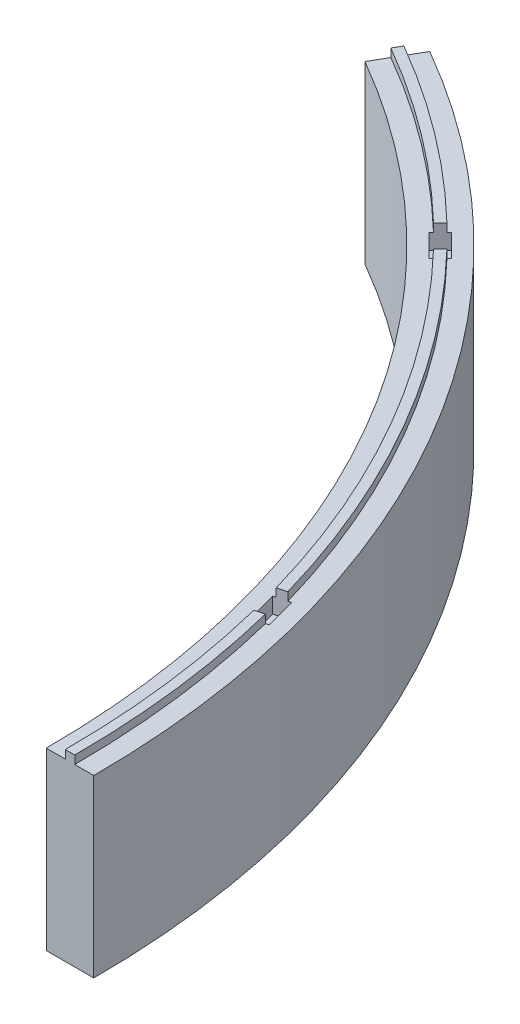
ISO-10303-21;
HEADER;
FILE_DESCRIPTION(('STEP AP214'),'2;1');
FILE_NAME('part.step','',(''),(''),'','','');
FILE_SCHEMA(('AUTOMOTIVE_DESIGN { 1 0 10303 214 1 1 1 1 }'));
ENDSEC;
DATA;
#1=APPLICATION_CONTEXT('core data for automotive mechanical design processes');
#2=APPLICATION_PROTOCOL_DEFINITION('international standard','automotive_design',2000,#1);
#3=PRODUCT_CONTEXT('',#1,'mechanical');
#4=PRODUCT('Part','Part','',(#3));
#5=PRODUCT_RELATED_PRODUCT_CATEGORY('part','',(#4));
#6=PRODUCT_DEFINITION_FORMATION('','',#4);
#7=PRODUCT_DEFINITION_CONTEXT('part definition',#1,'design');
#8=PRODUCT_DEFINITION('design','',#6,#7);
#9=PRODUCT_DEFINITION_SHAPE('','',#8);
#10=(LENGTH_UNIT() NAMED_UNIT(*) SI_UNIT(.MILLI.,.METRE.));
#11=(NAMED_UNIT(*) PLANE_ANGLE_UNIT() SI_UNIT($,.RADIAN.));
#12=(NAMED_UNIT(*) SI_UNIT($,.STERADIAN.) SOLID_ANGLE_UNIT());
#13=UNCERTAINTY_MEASURE_WITH_UNIT(LENGTH_MEASURE(1.E-05),#10,'distance_accuracy_value','');
#14=(GEOMETRIC_REPRESENTATION_CONTEXT(3) GLOBAL_UNCERTAINTY_ASSIGNED_CONTEXT((#13)) GLOBAL_UNIT_ASSIGNED_CONTEXT((#10,
#11,#12)) REPRESENTATION_CONTEXT('',''));
#15=CARTESIAN_POINT('',(0.,0.,0.));
#16=DIRECTION('',(0.,0.,1.));
#17=DIRECTION('',(1.,0.,0.));
#18=AXIS2_PLACEMENT_3D('',#15,#16,#17);
#19=CARTESIAN_POINT('',(0.,58.,0.));
#20=DIRECTION('',(0.,-1.,0.));
#21=DIRECTION('',(0.,0.,-1.));
#22=AXIS2_PLACEMENT_3D('',#19,#20,#21);
#23=CYLINDRICAL_SURFACE('',#22,284.);
#24=CARTESIAN_POINT('',(0.,58.,0.));
#25=DIRECTION('',(0.,1.,0.));
#26=DIRECTION('',(0.,0.,1.));
#27=AXIS2_PLACEMENT_3D('',#24,#25,#26);
#28=CIRCLE('',#27,284.);
#29=CARTESIAN_POINT('',(272.986321804708,58.,-78.3228453743647));
#30=VERTEX_POINT('',#29);
#31=CARTESIAN_POINT('',(204.322734693233,58.,-197.251666881369));
#32=VERTEX_POINT('',#31);
#33=EDGE_CURVE('E307',#30,#32,#28,.T.);
#34=ORIENTED_EDGE('',*,*,#33,.F.);
#35=DIRECTION('',(0.,-1.,0.));
#36=VECTOR('',#35,1.);
#37=CARTESIAN_POINT('',(272.986321804708,58.,-78.3228453743647));
#38=LINE('',#37,#36);
#39=CARTESIAN_POINT('',(272.986321804708,55.4,-78.3228453743647));
#40=VERTEX_POINT('',#39);
#41=EDGE_CURVE('E296',#30,#40,#38,.T.);
#42=ORIENTED_EDGE('',*,*,#41,.T.);
#43=CARTESIAN_POINT('',(0.,55.4,0.));
#44=DIRECTION('',(0.,1.,0.));
#45=DIRECTION('',(0.,0.,1.));
#46=AXIS2_PLACEMENT_3D('',#43,#44,#45);
#47=CIRCLE('',#46,284.);
#48=CARTESIAN_POINT('',(204.322734693233,55.4,-197.251666881369));
#49=VERTEX_POINT('',#48);
#50=EDGE_CURVE('E322',#40,#49,#47,.T.);
#51=ORIENTED_EDGE('',*,*,#50,.T.);
#52=DIRECTION('',(0.,-1.,0.));
#53=VECTOR('',#52,1.);
#54=CARTESIAN_POINT('',(204.322734693233,58.,-197.251666881369));
#55=LINE('',#54,#53);
#56=EDGE_CURVE('E263',#49,#32,#55,.F.);
#57=ORIENTED_EDGE('',*,*,#56,.T.);
#58=EDGE_LOOP('',(#34,#42,#51,#57));
#59=FACE_BOUND('',#58,.T.);
#60=ADVANCED_FACE('F36',(#59),#23,.T.);
#61=CARTESIAN_POINT('',(197.251666881368,58.,-204.322734693234));
#62=VERTEX_POINT('',#61);
#63=CARTESIAN_POINT('',(141.999999999999,58.,-245.951214674781));
#64=VERTEX_POINT('',#63);
#65=EDGE_CURVE('E308',#62,#64,#28,.T.);
#66=ORIENTED_EDGE('',*,*,#65,.F.);
#67=DIRECTION('',(0.,-1.,0.));
#68=VECTOR('',#67,1.);
#69=CARTESIAN_POINT('',(197.251666881368,58.,-204.322734693234));
#70=LINE('',#69,#68);
#71=CARTESIAN_POINT('',(197.251666881368,55.4,-204.322734693234));
#72=VERTEX_POINT('',#71);
#73=EDGE_CURVE('E275',#62,#72,#70,.T.);
#74=ORIENTED_EDGE('',*,*,#73,.T.);
#75=CARTESIAN_POINT('',(141.999999999999,55.4,-245.951214674781));
#76=VERTEX_POINT('',#75);
#77=EDGE_CURVE('E302',#72,#76,#47,.T.);
#78=ORIENTED_EDGE('',*,*,#77,.T.);
#79=DIRECTION('',(0.,-1.,0.));
#80=VECTOR('',#79,1.);
#81=CARTESIAN_POINT('',(141.999999999999,58.,-245.951214674781));
#82=LINE('',#81,#80);
#83=EDGE_CURVE('E335',#64,#76,#82,.T.);
#84=ORIENTED_EDGE('',*,*,#83,.F.);
#85=EDGE_LOOP('',(#66,#74,#78,#84));
#86=FACE_BOUND('',#85,.T.);
#87=ADVANCED_FACE('F420',(#86),#23,.T.);
#88=CARTESIAN_POINT('',(0.,58.,0.));
#89=DIRECTION('',(0.,-1.,0.));
#90=DIRECTION('',(0.,0.,-1.));
#91=AXIS2_PLACEMENT_3D('',#88,#89,#90);
#92=CYLINDRICAL_SURFACE('',#91,281.);
#93=CARTESIAN_POINT('',(0.,55.4,0.));
#94=DIRECTION('',(0.,-1.,0.));
#95=DIRECTION('',(0.,0.,1.));
#96=AXIS2_PLACEMENT_3D('',#93,#94,#95);
#97=CIRCLE('',#96,281.);
#98=CARTESIAN_POINT('',(202.201082001217,55.4,-195.130014189353));
#99=VERTEX_POINT('',#98);
#100=CARTESIAN_POINT('',(270.088090329406,55.4,-77.5462665910791));
#101=VERTEX_POINT('',#100);
#102=EDGE_CURVE('E326',#99,#101,#97,.T.);
#103=ORIENTED_EDGE('',*,*,#102,.T.);
#104=DIRECTION('',(0.,-1.,0.));
#105=VECTOR('',#104,1.);
#106=CARTESIAN_POINT('',(270.088090329406,58.,-77.5462665910791));
#107=LINE('',#106,#105);
#108=CARTESIAN_POINT('',(270.088090329406,58.,-77.5462665910791));
#109=VERTEX_POINT('',#108);
#110=EDGE_CURVE('E290',#101,#109,#107,.F.);
#111=ORIENTED_EDGE('',*,*,#110,.T.);
#112=CARTESIAN_POINT('',(0.,58.,0.));
#113=DIRECTION('',(0.,-1.,0.));
#114=DIRECTION('',(0.,0.,1.));
#115=AXIS2_PLACEMENT_3D('',#112,#113,#114);
#116=CIRCLE('',#115,281.);
#117=CARTESIAN_POINT('',(202.201082001217,58.,-195.130014189353));
#118=VERTEX_POINT('',#117);
#119=EDGE_CURVE('E315',#118,#109,#116,.T.);
#120=ORIENTED_EDGE('',*,*,#119,.F.);
#121=DIRECTION('',(0.,-1.,0.));
#122=VECTOR('',#121,1.);
#123=CARTESIAN_POINT('',(202.201082001217,58.,-195.130014189353));
#124=LINE('',#123,#122);
#125=EDGE_CURVE('E59',#118,#99,#124,.T.);
#126=ORIENTED_EDGE('',*,*,#125,.T.);
#127=EDGE_LOOP('',(#103,#111,#120,#126));
#128=FACE_BOUND('',#127,.T.);
#129=ADVANCED_FACE('F465',(#128),#92,.F.);
#130=CARTESIAN_POINT('',(140.499999999999,55.4,-243.353138463428));
#131=VERTEX_POINT('',#130);
#132=CARTESIAN_POINT('',(195.130014189352,55.4,-202.201082001218));
#133=VERTEX_POINT('',#132);
#134=EDGE_CURVE('E323',#131,#133,#97,.T.);
#135=ORIENTED_EDGE('',*,*,#134,.T.);
#136=DIRECTION('',(0.,-1.,0.));
#137=VECTOR('',#136,1.);
#138=CARTESIAN_POINT('',(195.130014189352,58.,-202.201082001218));
#139=LINE('',#138,#137);
#140=CARTESIAN_POINT('',(195.130014189352,58.,-202.201082001218));
#141=VERTEX_POINT('',#140);
#142=EDGE_CURVE('E269',#133,#141,#139,.F.);
#143=ORIENTED_EDGE('',*,*,#142,.T.);
#144=CARTESIAN_POINT('',(140.499999999999,58.,-243.353138463428));
#145=VERTEX_POINT('',#144);
#146=EDGE_CURVE('E311',#145,#141,#116,.T.);
#147=ORIENTED_EDGE('',*,*,#146,.F.);
#148=DIRECTION('',(0.,-1.,0.));
#149=VECTOR('',#148,1.);
#150=CARTESIAN_POINT('',(140.499999999999,58.,-243.353138463428));
#151=LINE('',#150,#149);
#152=EDGE_CURVE('E332',#145,#131,#151,.T.);
#153=ORIENTED_EDGE('',*,*,#152,.T.);
#154=EDGE_LOOP('',(#135,#143,#147,#153));
#155=FACE_BOUND('',#154,.T.);
#156=ADVANCED_FACE('F444',(#155),#92,.F.);
#157=CARTESIAN_POINT('',(0.,58.,0.));
#158=DIRECTION('',(0.,1.,0.));
#159=DIRECTION('',(0.,0.,1.));
#160=AXIS2_PLACEMENT_3D('',#157,#158,#159);
#161=PLANE('',#160);
#162=DIRECTION('',(-0.965925826289068,0.,0.258819045102523));
#163=VECTOR('',#162,1.);
#164=CARTESIAN_POINT('',(-1.29409522551254,58.,-4.82962913144506));
#165=LINE('',#164,#163);
#166=EDGE_CURVE('E378',#30,#109,#165,.T.);
#167=ORIENTED_EDGE('',*,*,#166,.F.);
#168=ORIENTED_EDGE('',*,*,#33,.T.);
#169=DIRECTION('',(0.70710678118655,0.,-0.707106781186545));
#170=VECTOR('',#169,1.);
#171=CARTESIAN_POINT('',(3.53553390593147,58.,3.5355339059315));
#172=LINE('',#171,#170);
#173=EDGE_CURVE('E372',#118,#32,#172,.T.);
#174=ORIENTED_EDGE('',*,*,#173,.F.);
#175=ORIENTED_EDGE('',*,*,#119,.T.);
#176=EDGE_LOOP('',(#167,#168,#174,#175));
#177=FACE_BOUND('',#176,.T.);
#178=ADVANCED_FACE('F405',(#177),#161,.T.);
#179=DIRECTION('',(-0.707106781186545,0.,0.70710678118655));
#180=VECTOR('',#179,1.);
#181=CARTESIAN_POINT('',(-3.53553390593246,58.,-3.53553390593243));
#182=LINE('',#181,#180);
#183=EDGE_CURVE('E374',#62,#141,#182,.T.);
#184=ORIENTED_EDGE('',*,*,#183,.F.);
#185=ORIENTED_EDGE('',*,*,#65,.T.);
#186=DIRECTION('',(-0.500000000000004,0.,0.866025403784436));
#187=VECTOR('',#186,1.);
#188=CARTESIAN_POINT('',(140.499999999999,58.,-243.353138463428));
#189=LINE('',#188,#187);
#190=EDGE_CURVE('E306',#64,#145,#189,.T.);
#191=ORIENTED_EDGE('',*,*,#190,.T.);
#192=ORIENTED_EDGE('',*,*,#146,.T.);
#193=EDGE_LOOP('',(#184,#185,#191,#192));
#194=FACE_BOUND('',#193,.T.);
#195=ADVANCED_FACE('F412',(#194),#161,.T.);
#196=CARTESIAN_POINT('',(0.,55.4,0.));
#197=DIRECTION('',(0.,-1.,0.));
#198=DIRECTION('',(0.,0.,-1.));
#199=AXIS2_PLACEMENT_3D('',#196,#197,#198);
#200=PLANE('',#199);
#201=ORIENTED_EDGE('',*,*,#50,.F.);
#202=DIRECTION('',(0.965925826289068,0.,-0.258819045102523));
#203=VECTOR('',#202,1.);
#204=CARTESIAN_POINT('',(-1.29409522551254,55.4,-4.82962913144506));
#205=LINE('',#204,#203);
#206=CARTESIAN_POINT('',(273.994765266872,55.4,-78.593056985664));
#207=VERTEX_POINT('',#206);
#208=EDGE_CURVE('E299',#40,#207,#205,.T.);
#209=ORIENTED_EDGE('',*,*,#208,.T.);
#210=DIRECTION('',(0.258819045102526,0.,0.965925826289067));
#211=VECTOR('',#210,1.);
#212=CARTESIAN_POINT('',(275.288860492384,55.4,-73.7634278542198));
#213=LINE('',#212,#211);
#214=CARTESIAN_POINT('',(276.582955717897,55.4,-68.9337987227733));
#215=VERTEX_POINT('',#214);
#216=EDGE_CURVE('E11',#207,#215,#213,.T.);
#217=ORIENTED_EDGE('',*,*,#216,.T.);
#218=DIRECTION('',(-0.965925826289068,0.,0.258819045102522));
#219=VECTOR('',#218,1.);
#220=CARTESIAN_POINT('',(1.29409522551267,55.4,4.82962913144554));
#221=LINE('',#220,#219);
#222=CARTESIAN_POINT('',(275.574512255733,55.4,-68.663587111474));
#223=VERTEX_POINT('',#222);
#224=EDGE_CURVE('E287',#215,#223,#221,.T.);
#225=ORIENTED_EDGE('',*,*,#224,.T.);
#226=CARTESIAN_POINT('',(284.,55.4,0.));
#227=VERTEX_POINT('',#226);
#228=EDGE_CURVE('E318',#227,#223,#47,.T.);
#229=ORIENTED_EDGE('',*,*,#228,.F.);
#230=DIRECTION('',(1.,0.,0.));
#231=VECTOR('',#230,1.);
#232=CARTESIAN_POINT('',(275.,55.4,0.));
#233=LINE('',#232,#231);
#234=CARTESIAN_POINT('',(290.,55.4,0.));
#235=VERTEX_POINT('',#234);
#236=EDGE_CURVE('E349',#227,#235,#233,.T.);
#237=ORIENTED_EDGE('',*,*,#236,.T.);
#238=CARTESIAN_POINT('',(0.,55.4,0.));
#239=DIRECTION('',(0.,1.,0.));
#240=DIRECTION('',(0.,0.,-1.));
#241=AXIS2_PLACEMENT_3D('',#238,#239,#240);
#242=CIRCLE('',#241,290.);
#243=CARTESIAN_POINT('',(144.999999999999,55.4,-251.147367097488));
#244=VERTEX_POINT('',#243);
#245=EDGE_CURVE('E339',#235,#244,#242,.T.);
#246=ORIENTED_EDGE('',*,*,#245,.T.);
#247=DIRECTION('',(-0.499999999999998,0.,0.86602540378444));
#248=VECTOR('',#247,1.);
#249=CARTESIAN_POINT('',(137.499999999999,55.4,-238.156986040721));
#250=LINE('',#249,#248);
#251=EDGE_CURVE('E344',#244,#76,#250,.T.);
#252=ORIENTED_EDGE('',*,*,#251,.T.);
#253=ORIENTED_EDGE('',*,*,#77,.F.);
#254=DIRECTION('',(0.707106781186545,0.,-0.70710678118655));
#255=VECTOR('',#254,1.);
#256=CARTESIAN_POINT('',(-3.53553390593246,55.4,-3.53553390593243));
#257=LINE('',#256,#255);
#258=CARTESIAN_POINT('',(197.989898732233,55.4,-205.060966544099));
#259=VERTEX_POINT('',#258);
#260=EDGE_CURVE('E278',#72,#259,#257,.T.);
#261=ORIENTED_EDGE('',*,*,#260,.T.);
#262=DIRECTION('',(0.707106781186549,0.,0.707106781186546));
#263=VECTOR('',#262,1.);
#264=CARTESIAN_POINT('',(201.525432638166,55.4,-201.525432638166));
#265=LINE('',#264,#263);
#266=CARTESIAN_POINT('',(205.060966544098,55.4,-197.989898732234));
#267=VERTEX_POINT('',#266);
#268=EDGE_CURVE('E44',#259,#267,#265,.T.);
#269=ORIENTED_EDGE('',*,*,#268,.T.);
#270=DIRECTION('',(-0.70710678118655,0.,0.707106781186545));
#271=VECTOR('',#270,1.);
#272=CARTESIAN_POINT('',(3.53553390593147,55.4,3.5355339059315));
#273=LINE('',#272,#271);
#274=EDGE_CURVE('E266',#267,#49,#273,.T.);
#275=ORIENTED_EDGE('',*,*,#274,.T.);
#276=EDGE_LOOP('',(#201,#209,#217,#225,#229,#237,#246,#252,#253,#261,#269,#275));
#277=FACE_BOUND('',#276,.T.);
#278=ADVANCED_FACE('F386',(#277),#200,.F.);
#279=DIRECTION('',(-0.258819045102515,0.,-0.96592582628907));
#280=VECTOR('',#279,1.);
#281=CARTESIAN_POINT('',(270.459231360939,55.4,-72.4693326287041));
#282=LINE('',#281,#280);
#283=CARTESIAN_POINT('',(271.753326586451,55.4,-67.6397034972607));
#284=VERTEX_POINT('',#283);
#285=CARTESIAN_POINT('',(269.165136135426,55.4,-77.2989617601514));
#286=VERTEX_POINT('',#285);
#287=EDGE_CURVE('E205',#284,#286,#282,.T.);
#288=ORIENTED_EDGE('',*,*,#287,.T.);
#289=DIRECTION('',(0.965925826289068,0.,-0.258819045102523));
#290=VECTOR('',#289,1.);
#291=CARTESIAN_POINT('',(-1.29409522551254,55.4,-4.82962913144506));
#292=LINE('',#291,#290);
#293=EDGE_CURVE('E293',#286,#101,#292,.T.);
#294=ORIENTED_EDGE('',*,*,#293,.T.);
#295=ORIENTED_EDGE('',*,*,#102,.F.);
#296=DIRECTION('',(-0.70710678118655,0.,0.707106781186545));
#297=VECTOR('',#296,1.);
#298=CARTESIAN_POINT('',(3.53553390593147,55.4,3.5355339059315));
#299=LINE('',#298,#297);
#300=CARTESIAN_POINT('',(201.525432638166,55.4,-194.454364826301));
#301=VERTEX_POINT('',#300);
#302=EDGE_CURVE('E260',#99,#301,#299,.T.);
#303=ORIENTED_EDGE('',*,*,#302,.T.);
#304=DIRECTION('',(-0.707106781186549,0.,-0.707106781186546));
#305=VECTOR('',#304,1.);
#306=CARTESIAN_POINT('',(197.989898732233,55.4,-197.989898732234));
#307=LINE('',#306,#305);
#308=CARTESIAN_POINT('',(194.4543648263,55.4,-201.525432638166));
#309=VERTEX_POINT('',#308);
#310=EDGE_CURVE('E380',#301,#309,#307,.T.);
#311=ORIENTED_EDGE('',*,*,#310,.T.);
#312=DIRECTION('',(0.707106781186545,0.,-0.70710678118655));
#313=VECTOR('',#312,1.);
#314=CARTESIAN_POINT('',(-3.53553390593246,55.4,-3.53553390593243));
#315=LINE('',#314,#313);
#316=EDGE_CURVE('E272',#309,#133,#315,.T.);
#317=ORIENTED_EDGE('',*,*,#316,.T.);
#318=ORIENTED_EDGE('',*,*,#134,.F.);
#319=CARTESIAN_POINT('',(137.499999999999,55.4,-238.156986040721));
#320=VERTEX_POINT('',#319);
#321=EDGE_CURVE('E342',#131,#320,#250,.T.);
#322=ORIENTED_EDGE('',*,*,#321,.T.);
#323=CARTESIAN_POINT('',(0.,55.4,0.));
#324=DIRECTION('',(0.,-1.,0.));
#325=DIRECTION('',(0.,0.,-1.));
#326=AXIS2_PLACEMENT_3D('',#323,#324,#325);
#327=CIRCLE('',#326,275.);
#328=CARTESIAN_POINT('',(275.,55.4,0.));
#329=VERTEX_POINT('',#328);
#330=EDGE_CURVE('E347',#320,#329,#327,.T.);
#331=ORIENTED_EDGE('',*,*,#330,.T.);
#332=CARTESIAN_POINT('',(281.,55.4,0.));
#333=VERTEX_POINT('',#332);
#334=EDGE_CURVE('E350',#329,#333,#233,.T.);
#335=ORIENTED_EDGE('',*,*,#334,.T.);
#336=CARTESIAN_POINT('',(272.676280780431,55.4,-67.8870083281884));
#337=VERTEX_POINT('',#336);
#338=EDGE_CURVE('E321',#337,#333,#97,.T.);
#339=ORIENTED_EDGE('',*,*,#338,.F.);
#340=DIRECTION('',(-0.965925826289068,0.,0.258819045102522));
#341=VECTOR('',#340,1.);
#342=CARTESIAN_POINT('',(1.29409522551267,55.4,4.82962913144554));
#343=LINE('',#342,#341);
#344=EDGE_CURVE('E282',#337,#284,#343,.T.);
#345=ORIENTED_EDGE('',*,*,#344,.T.);
#346=EDGE_LOOP('',(#288,#294,#295,#303,#311,#317,#318,#322,#331,#335,#339,#345));
#347=FACE_BOUND('',#346,.T.);
#348=ADVANCED_FACE('F442',(#347),#200,.F.);
#349=CARTESIAN_POINT('',(0.,55.4,0.));
#350=DIRECTION('',(0.,-1.,0.));
#351=DIRECTION('',(0.,0.,-1.));
#352=AXIS2_PLACEMENT_3D('',#349,#350,#351);
#353=CYLINDRICAL_SURFACE('',#352,290.);
#354=CARTESIAN_POINT('',(0.,0.,0.));
#355=DIRECTION('',(0.,1.,0.));
#356=DIRECTION('',(0.,0.,-1.));
#357=AXIS2_PLACEMENT_3D('',#354,#355,#356);
#358=CIRCLE('',#357,290.);
#359=CARTESIAN_POINT('',(290.,0.,0.));
#360=VERTEX_POINT('',#359);
#361=CARTESIAN_POINT('',(144.999999999999,0.,-251.147367097488));
#362=VERTEX_POINT('',#361);
#363=EDGE_CURVE('E338',#360,#362,#358,.T.);
#364=ORIENTED_EDGE('',*,*,#363,.T.);
#365=DIRECTION('',(0.,-1.,0.));
#366=VECTOR('',#365,1.);
#367=CARTESIAN_POINT('',(144.999999999999,55.4,-251.147367097488));
#368=LINE('',#367,#366);
#369=EDGE_CURVE('E369',#244,#362,#368,.T.);
#370=ORIENTED_EDGE('',*,*,#369,.F.);
#371=ORIENTED_EDGE('',*,*,#245,.F.);
#372=DIRECTION('',(0.,-1.,0.));
#373=VECTOR('',#372,1.);
#374=CARTESIAN_POINT('',(290.,55.4,0.));
#375=LINE('',#374,#373);
#376=EDGE_CURVE('E353',#235,#360,#375,.T.);
#377=ORIENTED_EDGE('',*,*,#376,.T.);
#378=EDGE_LOOP('',(#364,#370,#371,#377));
#379=FACE_BOUND('',#378,.T.);
#380=ADVANCED_FACE('F38',(#379),#353,.T.);
#381=CARTESIAN_POINT('',(137.499999999999,55.4,-238.156986040721));
#382=DIRECTION('',(0.86602540378444,0.,0.499999999999998));
#383=DIRECTION('',(0.499999999999998,0.,-0.86602540378444));
#384=AXIS2_PLACEMENT_3D('',#381,#382,#383);
#385=PLANE('',#384);
#386=DIRECTION('',(-0.499999999999998,0.,0.86602540378444));
#387=VECTOR('',#386,1.);
#388=CARTESIAN_POINT('',(137.499999999999,0.,-238.156986040721));
#389=LINE('',#388,#387);
#390=CARTESIAN_POINT('',(137.499999999999,0.,-238.156986040721));
#391=VERTEX_POINT('',#390);
#392=EDGE_CURVE('E356',#362,#391,#389,.T.);
#393=ORIENTED_EDGE('',*,*,#392,.T.);
#394=DIRECTION('',(0.,-1.,0.));
#395=VECTOR('',#394,1.);
#396=CARTESIAN_POINT('',(137.499999999999,55.4,-238.156986040721));
#397=LINE('',#396,#395);
#398=EDGE_CURVE('E366',#320,#391,#397,.T.);
#399=ORIENTED_EDGE('',*,*,#398,.F.);
#400=ORIENTED_EDGE('',*,*,#321,.F.);
#401=ORIENTED_EDGE('',*,*,#152,.F.);
#402=ORIENTED_EDGE('',*,*,#190,.F.);
#403=ORIENTED_EDGE('',*,*,#83,.T.);
#404=ORIENTED_EDGE('',*,*,#251,.F.);
#405=ORIENTED_EDGE('',*,*,#369,.T.);
#406=EDGE_LOOP('',(#393,#399,#400,#401,#402,#403,#404,#405));
#407=FACE_BOUND('',#406,.T.);
#408=ADVANCED_FACE('F417',(#407),#385,.F.);
#409=CARTESIAN_POINT('',(0.,55.4,0.));
#410=DIRECTION('',(0.,-1.,0.));
#411=DIRECTION('',(0.,0.,-1.));
#412=AXIS2_PLACEMENT_3D('',#409,#410,#411);
#413=CYLINDRICAL_SURFACE('',#412,275.);
#414=CARTESIAN_POINT('',(0.,0.,0.));
#415=DIRECTION('',(0.,-1.,0.));
#416=DIRECTION('',(0.,0.,-1.));
#417=AXIS2_PLACEMENT_3D('',#414,#415,#416);
#418=CIRCLE('',#417,275.);
#419=CARTESIAN_POINT('',(275.,0.,0.));
#420=VERTEX_POINT('',#419);
#421=EDGE_CURVE('E358',#391,#420,#418,.T.);
#422=ORIENTED_EDGE('',*,*,#421,.T.);
#423=DIRECTION('',(0.,-1.,0.));
#424=VECTOR('',#423,1.);
#425=CARTESIAN_POINT('',(275.,55.4,0.));
#426=LINE('',#425,#424);
#427=EDGE_CURVE('E363',#329,#420,#426,.T.);
#428=ORIENTED_EDGE('',*,*,#427,.F.);
#429=ORIENTED_EDGE('',*,*,#330,.F.);
#430=ORIENTED_EDGE('',*,*,#398,.T.);
#431=EDGE_LOOP('',(#422,#428,#429,#430));
#432=FACE_BOUND('',#431,.T.);
#433=ADVANCED_FACE('F433',(#432),#413,.F.);
#434=CARTESIAN_POINT('',(275.,55.4,0.));
#435=DIRECTION('',(0.,0.,-1.));
#436=DIRECTION('',(-1.,0.,0.));
#437=AXIS2_PLACEMENT_3D('',#434,#435,#436);
#438=PLANE('',#437);
#439=DIRECTION('',(1.,0.,0.));
#440=VECTOR('',#439,1.);
#441=CARTESIAN_POINT('',(275.,0.,0.));
#442=LINE('',#441,#440);
#443=EDGE_CURVE('E343',#420,#360,#442,.T.);
#444=ORIENTED_EDGE('',*,*,#443,.T.);
#445=ORIENTED_EDGE('',*,*,#376,.F.);
#446=ORIENTED_EDGE('',*,*,#236,.F.);
#447=DIRECTION('',(0.,-1.,0.));
#448=VECTOR('',#447,1.);
#449=CARTESIAN_POINT('',(284.,58.,0.));
#450=LINE('',#449,#448);
#451=CARTESIAN_POINT('',(284.,58.,0.));
#452=VERTEX_POINT('',#451);
#453=EDGE_CURVE('E317',#452,#227,#450,.T.);
#454=ORIENTED_EDGE('',*,*,#453,.F.);
#455=DIRECTION('',(1.,0.,0.));
#456=VECTOR('',#455,1.);
#457=CARTESIAN_POINT('',(281.,58.,0.));
#458=LINE('',#457,#456);
#459=CARTESIAN_POINT('',(281.,58.,0.));
#460=VERTEX_POINT('',#459);
#461=EDGE_CURVE('E314',#460,#452,#458,.T.);
#462=ORIENTED_EDGE('',*,*,#461,.F.);
#463=DIRECTION('',(0.,-1.,0.));
#464=VECTOR('',#463,1.);
#465=CARTESIAN_POINT('',(281.,58.,0.));
#466=LINE('',#465,#464);
#467=EDGE_CURVE('E329',#460,#333,#466,.T.);
#468=ORIENTED_EDGE('',*,*,#467,.T.);
#469=ORIENTED_EDGE('',*,*,#334,.F.);
#470=ORIENTED_EDGE('',*,*,#427,.T.);
#471=EDGE_LOOP('',(#444,#445,#446,#454,#462,#468,#469,#470));
#472=FACE_BOUND('',#471,.T.);
#473=ADVANCED_FACE('F437',(#472),#438,.F.);
#474=CARTESIAN_POINT('',(0.,0.,0.));
#475=DIRECTION('',(0.,-1.,0.));
#476=DIRECTION('',(0.,0.,-1.));
#477=AXIS2_PLACEMENT_3D('',#474,#475,#476);
#478=PLANE('',#477);
#479=CARTESIAN_POINT('',(199.757665685199,0.,-199.7576656852));
#480=DIRECTION('',(0.,-1.,0.));
#481=DIRECTION('',(0.,0.,-1.));
#482=AXIS2_PLACEMENT_3D('',#479,#480,#481);
#483=CIRCLE('',#482,2.20000000000001);
#484=CARTESIAN_POINT('',(199.757665685199,0.,-201.9576656852));
#485=VERTEX_POINT('',#484);
#486=EDGE_CURVE('E757',#485,#485,#483,.T.);
#487=ORIENTED_EDGE('',*,*,#486,.F.);
#488=EDGE_LOOP('',(#487));
#489=FACE_BOUND('',#488,.T.);
#490=CARTESIAN_POINT('',(272.874045926662,0.,-73.1163802414623));
#491=DIRECTION('',(0.,-1.,0.));
#492=DIRECTION('',(0.,0.,-1.));
#493=AXIS2_PLACEMENT_3D('',#490,#491,#492);
#494=CIRCLE('',#493,2.20000000000004);
#495=CARTESIAN_POINT('',(272.874045926662,0.,-75.3163802414623));
#496=VERTEX_POINT('',#495);
#497=EDGE_CURVE('E760',#496,#496,#494,.T.);
#498=ORIENTED_EDGE('',*,*,#497,.F.);
#499=EDGE_LOOP('',(#498));
#500=FACE_BOUND('',#499,.T.);
#501=ORIENTED_EDGE('',*,*,#363,.F.);
#502=ORIENTED_EDGE('',*,*,#443,.F.);
#503=ORIENTED_EDGE('',*,*,#421,.F.);
#504=ORIENTED_EDGE('',*,*,#392,.F.);
#505=EDGE_LOOP('',(#501,#502,#503,#504));
#506=FACE_BOUND('',#505,.T.);
#507=ADVANCED_FACE('F429',(#489,#500,#506),#478,.T.);
#508=ORIENTED_EDGE('',*,*,#228,.T.);
#509=DIRECTION('',(0.,-1.,0.));
#510=VECTOR('',#509,1.);
#511=CARTESIAN_POINT('',(275.574512255733,58.,-68.663587111474));
#512=LINE('',#511,#510);
#513=CARTESIAN_POINT('',(275.574512255733,58.,-68.663587111474));
#514=VERTEX_POINT('',#513);
#515=EDGE_CURVE('E284',#223,#514,#512,.F.);
#516=ORIENTED_EDGE('',*,*,#515,.T.);
#517=EDGE_CURVE('E303',#452,#514,#28,.T.);
#518=ORIENTED_EDGE('',*,*,#517,.F.);
#519=ORIENTED_EDGE('',*,*,#453,.T.);
#520=EDGE_LOOP('',(#508,#516,#518,#519));
#521=FACE_BOUND('',#520,.T.);
#522=ADVANCED_FACE('F461',(#521),#23,.T.);
#523=CARTESIAN_POINT('',(272.676280780431,58.,-67.8870083281884));
#524=VERTEX_POINT('',#523);
#525=EDGE_CURVE('E310',#524,#460,#116,.T.);
#526=ORIENTED_EDGE('',*,*,#525,.F.);
#527=DIRECTION('',(0.,-1.,0.));
#528=VECTOR('',#527,1.);
#529=CARTESIAN_POINT('',(272.676280780431,58.,-67.8870083281884));
#530=LINE('',#529,#528);
#531=EDGE_CURVE('E51',#524,#337,#530,.T.);
#532=ORIENTED_EDGE('',*,*,#531,.T.);
#533=ORIENTED_EDGE('',*,*,#338,.T.);
#534=ORIENTED_EDGE('',*,*,#467,.F.);
#535=EDGE_LOOP('',(#526,#532,#533,#534));
#536=FACE_BOUND('',#535,.T.);
#537=ADVANCED_FACE('F469',(#536),#92,.F.);
#538=DIRECTION('',(0.965925826289068,0.,-0.258819045102522));
#539=VECTOR('',#538,1.);
#540=CARTESIAN_POINT('',(1.29409522551267,58.,4.82962913144554));
#541=LINE('',#540,#539);
#542=EDGE_CURVE('E376',#524,#514,#541,.T.);
#543=ORIENTED_EDGE('',*,*,#542,.F.);
#544=ORIENTED_EDGE('',*,*,#525,.T.);
#545=ORIENTED_EDGE('',*,*,#461,.T.);
#546=ORIENTED_EDGE('',*,*,#517,.T.);
#547=EDGE_LOOP('',(#543,#544,#545,#546));
#548=FACE_BOUND('',#547,.T.);
#549=ADVANCED_FACE('F455',(#548),#161,.T.);
#550=CARTESIAN_POINT('',(197.989898732233,50.5,-205.060966544099));
#551=DIRECTION('',(0.707106781186546,0.,-0.707106781186549));
#552=DIRECTION('',(-0.707106781186549,0.,-0.707106781186546));
#553=AXIS2_PLACEMENT_3D('',#550,#551,#552);
#554=PLANE('',#553);
#555=DIRECTION('',(0.,1.,0.));
#556=VECTOR('',#555,1.);
#557=CARTESIAN_POINT('',(197.989898732233,50.5,-205.060966544099));
#558=LINE('',#557,#556);
#559=CARTESIAN_POINT('',(197.989898732233,50.5,-205.060966544099));
#560=VERTEX_POINT('',#559);
#561=EDGE_CURVE('E245',#560,#259,#558,.T.);
#562=ORIENTED_EDGE('',*,*,#561,.F.);
#563=DIRECTION('',(-0.707106781186549,0.,-0.707106781186546));
#564=VECTOR('',#563,1.);
#565=CARTESIAN_POINT('',(197.989898732233,50.5,-205.060966544099));
#566=LINE('',#565,#564);
#567=CARTESIAN_POINT('',(205.060966544098,50.5,-197.989898732234));
#568=VERTEX_POINT('',#567);
#569=EDGE_CURVE('E254',#568,#560,#566,.T.);
#570=ORIENTED_EDGE('',*,*,#569,.F.);
#571=DIRECTION('',(0.,1.,0.));
#572=VECTOR('',#571,1.);
#573=CARTESIAN_POINT('',(205.060966544098,50.5,-197.989898732234));
#574=LINE('',#573,#572);
#575=EDGE_CURVE('E242',#568,#267,#574,.T.);
#576=ORIENTED_EDGE('',*,*,#575,.T.);
#577=ORIENTED_EDGE('',*,*,#268,.F.);
#578=EDGE_LOOP('',(#562,#570,#576,#577));
#579=FACE_BOUND('',#578,.T.);
#580=ADVANCED_FACE('F390',(#579),#554,.F.);
#581=CARTESIAN_POINT('',(201.525432638166,50.5,-194.454364826301));
#582=DIRECTION('',(-0.707106781186546,0.,0.707106781186549));
#583=DIRECTION('',(0.707106781186549,0.,0.707106781186546));
#584=AXIS2_PLACEMENT_3D('',#581,#582,#583);
#585=PLANE('',#584);
#586=DIRECTION('',(0.,1.,0.));
#587=VECTOR('',#586,1.);
#588=CARTESIAN_POINT('',(201.525432638166,50.5,-194.454364826301));
#589=LINE('',#588,#587);
#590=CARTESIAN_POINT('',(201.525432638166,50.5,-194.454364826301));
#591=VERTEX_POINT('',#590);
#592=EDGE_CURVE('E238',#591,#301,#589,.T.);
#593=ORIENTED_EDGE('',*,*,#592,.F.);
#594=DIRECTION('',(0.707106781186549,0.,0.707106781186546));
#595=VECTOR('',#594,1.);
#596=CARTESIAN_POINT('',(201.525432638166,50.5,-194.454364826301));
#597=LINE('',#596,#595);
#598=CARTESIAN_POINT('',(194.4543648263,50.5,-201.525432638166));
#599=VERTEX_POINT('',#598);
#600=EDGE_CURVE('E221',#599,#591,#597,.T.);
#601=ORIENTED_EDGE('',*,*,#600,.F.);
#602=DIRECTION('',(0.,1.,0.));
#603=VECTOR('',#602,1.);
#604=CARTESIAN_POINT('',(194.4543648263,50.5,-201.525432638166));
#605=LINE('',#604,#603);
#606=EDGE_CURVE('E248',#599,#309,#605,.T.);
#607=ORIENTED_EDGE('',*,*,#606,.T.);
#608=ORIENTED_EDGE('',*,*,#310,.F.);
#609=EDGE_LOOP('',(#593,#601,#607,#608));
#610=FACE_BOUND('',#609,.T.);
#611=ADVANCED_FACE('F447',(#610),#585,.F.);
#612=CARTESIAN_POINT('',(194.4543648263,50.5,-201.525432638166));
#613=DIRECTION('',(-0.70710678118655,0.,-0.707106781186545));
#614=DIRECTION('',(-0.707106781186545,0.,0.70710678118655));
#615=AXIS2_PLACEMENT_3D('',#612,#613,#614);
#616=PLANE('',#615);
#617=ORIENTED_EDGE('',*,*,#73,.F.);
#618=ORIENTED_EDGE('',*,*,#183,.T.);
#619=ORIENTED_EDGE('',*,*,#142,.F.);
#620=ORIENTED_EDGE('',*,*,#316,.F.);
#621=ORIENTED_EDGE('',*,*,#606,.F.);
#622=DIRECTION('',(-0.707106781186545,0.,0.70710678118655));
#623=VECTOR('',#622,1.);
#624=CARTESIAN_POINT('',(194.4543648263,50.5,-201.525432638166));
#625=LINE('',#624,#623);
#626=EDGE_CURVE('E241',#560,#599,#625,.T.);
#627=ORIENTED_EDGE('',*,*,#626,.F.);
#628=ORIENTED_EDGE('',*,*,#561,.T.);
#629=ORIENTED_EDGE('',*,*,#260,.F.);
#630=EDGE_LOOP('',(#617,#618,#619,#620,#621,#627,#628,#629));
#631=FACE_BOUND('',#630,.T.);
#632=ADVANCED_FACE('F394',(#631),#616,.F.);
#633=CARTESIAN_POINT('',(205.060966544098,50.5,-197.989898732234));
#634=DIRECTION('',(0.707106781186545,0.,0.70710678118655));
#635=DIRECTION('',(0.70710678118655,0.,-0.707106781186545));
#636=AXIS2_PLACEMENT_3D('',#633,#634,#635);
#637=PLANE('',#636);
#638=ORIENTED_EDGE('',*,*,#575,.F.);
#639=DIRECTION('',(0.70710678118655,0.,-0.707106781186545));
#640=VECTOR('',#639,1.);
#641=CARTESIAN_POINT('',(205.060966544098,50.5,-197.989898732234));
#642=LINE('',#641,#640);
#643=EDGE_CURVE('E224',#591,#568,#642,.T.);
#644=ORIENTED_EDGE('',*,*,#643,.F.);
#645=ORIENTED_EDGE('',*,*,#592,.T.);
#646=ORIENTED_EDGE('',*,*,#302,.F.);
#647=ORIENTED_EDGE('',*,*,#125,.F.);
#648=ORIENTED_EDGE('',*,*,#173,.T.);
#649=ORIENTED_EDGE('',*,*,#56,.F.);
#650=ORIENTED_EDGE('',*,*,#274,.F.);
#651=EDGE_LOOP('',(#638,#644,#645,#646,#647,#648,#649,#650));
#652=FACE_BOUND('',#651,.T.);
#653=ADVANCED_FACE('F399',(#652),#637,.F.);
#654=CARTESIAN_POINT('',(0.,50.5,0.));
#655=DIRECTION('',(0.,-1.,0.));
#656=DIRECTION('',(0.,0.,-1.));
#657=AXIS2_PLACEMENT_3D('',#654,#655,#656);
#658=PLANE('',#657);
#659=ORIENTED_EDGE('',*,*,#600,.T.);
#660=ORIENTED_EDGE('',*,*,#643,.T.);
#661=ORIENTED_EDGE('',*,*,#569,.T.);
#662=ORIENTED_EDGE('',*,*,#626,.T.);
#663=EDGE_LOOP('',(#659,#660,#661,#662));
#664=FACE_BOUND('',#663,.T.);
#665=ADVANCED_FACE('F397',(#664),#658,.F.);
#666=CARTESIAN_POINT('',(273.994765266872,50.5,-78.593056985664));
#667=DIRECTION('',(0.965925826289067,0.,-0.258819045102526));
#668=DIRECTION('',(-0.258819045102526,0.,-0.965925826289067));
#669=AXIS2_PLACEMENT_3D('',#666,#667,#668);
#670=PLANE('',#669);
#671=DIRECTION('',(0.,1.,0.));
#672=VECTOR('',#671,1.);
#673=CARTESIAN_POINT('',(273.994765266872,50.5,-78.593056985664));
#674=LINE('',#673,#672);
#675=CARTESIAN_POINT('',(273.994765266872,50.5,-78.593056985664));
#676=VERTEX_POINT('',#675);
#677=EDGE_CURVE('E234',#676,#207,#674,.T.);
#678=ORIENTED_EDGE('',*,*,#677,.F.);
#679=DIRECTION('',(-0.258819045102526,0.,-0.965925826289067));
#680=VECTOR('',#679,1.);
#681=CARTESIAN_POINT('',(273.994765266872,50.5,-78.593056985664));
#682=LINE('',#681,#680);
#683=CARTESIAN_POINT('',(276.582955717897,50.5,-68.9337987227733));
#684=VERTEX_POINT('',#683);
#685=EDGE_CURVE('E217',#684,#676,#682,.T.);
#686=ORIENTED_EDGE('',*,*,#685,.F.);
#687=DIRECTION('',(0.,1.,0.));
#688=VECTOR('',#687,1.);
#689=CARTESIAN_POINT('',(276.582955717897,50.5,-68.9337987227733));
#690=LINE('',#689,#688);
#691=EDGE_CURVE('E207',#684,#215,#690,.T.);
#692=ORIENTED_EDGE('',*,*,#691,.T.);
#693=ORIENTED_EDGE('',*,*,#216,.F.);
#694=EDGE_LOOP('',(#678,#686,#692,#693));
#695=FACE_BOUND('',#694,.T.);
#696=ADVANCED_FACE('F488',(#695),#670,.F.);
#697=CARTESIAN_POINT('',(271.753326586451,50.5,-67.6397034972607));
#698=DIRECTION('',(-0.96592582628907,0.,0.258819045102515));
#699=DIRECTION('',(0.258819045102515,0.,0.96592582628907));
#700=AXIS2_PLACEMENT_3D('',#697,#698,#699);
#701=PLANE('',#700);
#702=DIRECTION('',(0.,1.,0.));
#703=VECTOR('',#702,1.);
#704=CARTESIAN_POINT('',(271.753326586451,50.5,-67.6397034972607));
#705=LINE('',#704,#703);
#706=CARTESIAN_POINT('',(271.753326586451,50.5,-67.6397034972607));
#707=VERTEX_POINT('',#706);
#708=EDGE_CURVE('E197',#707,#284,#705,.T.);
#709=ORIENTED_EDGE('',*,*,#708,.F.);
#710=DIRECTION('',(0.258819045102515,0.,0.96592582628907));
#711=VECTOR('',#710,1.);
#712=CARTESIAN_POINT('',(271.753326586451,50.5,-67.6397034972607));
#713=LINE('',#712,#711);
#714=CARTESIAN_POINT('',(269.165136135426,50.5,-77.2989617601514));
#715=VERTEX_POINT('',#714);
#716=EDGE_CURVE('E202',#715,#707,#713,.T.);
#717=ORIENTED_EDGE('',*,*,#716,.F.);
#718=DIRECTION('',(0.,1.,0.));
#719=VECTOR('',#718,1.);
#720=CARTESIAN_POINT('',(269.165136135426,50.5,-77.2989617601514));
#721=LINE('',#720,#719);
#722=EDGE_CURVE('E232',#715,#286,#721,.T.);
#723=ORIENTED_EDGE('',*,*,#722,.T.);
#724=ORIENTED_EDGE('',*,*,#287,.F.);
#725=EDGE_LOOP('',(#709,#717,#723,#724));
#726=FACE_BOUND('',#725,.T.);
#727=ADVANCED_FACE('F199',(#726),#701,.F.);
#728=CARTESIAN_POINT('',(269.165136135426,50.5,-77.2989617601514));
#729=DIRECTION('',(-0.258819045102523,0.,-0.965925826289068));
#730=DIRECTION('',(-0.965925826289068,0.,0.258819045102523));
#731=AXIS2_PLACEMENT_3D('',#728,#729,#730);
#732=PLANE('',#731);
#733=ORIENTED_EDGE('',*,*,#41,.F.);
#734=ORIENTED_EDGE('',*,*,#166,.T.);
#735=ORIENTED_EDGE('',*,*,#110,.F.);
#736=ORIENTED_EDGE('',*,*,#293,.F.);
#737=ORIENTED_EDGE('',*,*,#722,.F.);
#738=DIRECTION('',(-0.965925826289068,0.,0.258819045102523));
#739=VECTOR('',#738,1.);
#740=CARTESIAN_POINT('',(269.165136135426,50.5,-77.2989617601514));
#741=LINE('',#740,#739);
#742=EDGE_CURVE('E208',#676,#715,#741,.T.);
#743=ORIENTED_EDGE('',*,*,#742,.F.);
#744=ORIENTED_EDGE('',*,*,#677,.T.);
#745=ORIENTED_EDGE('',*,*,#208,.F.);
#746=EDGE_LOOP('',(#733,#734,#735,#736,#737,#743,#744,#745));
#747=FACE_BOUND('',#746,.T.);
#748=ADVANCED_FACE('F486',(#747),#732,.F.);
#749=CARTESIAN_POINT('',(276.582955717897,50.5,-68.9337987227733));
#750=DIRECTION('',(0.258819045102522,0.,0.965925826289068));
#751=DIRECTION('',(0.965925826289068,0.,-0.258819045102522));
#752=AXIS2_PLACEMENT_3D('',#749,#750,#751);
#753=PLANE('',#752);
#754=ORIENTED_EDGE('',*,*,#691,.F.);
#755=DIRECTION('',(0.965925826289068,0.,-0.258819045102522));
#756=VECTOR('',#755,1.);
#757=CARTESIAN_POINT('',(276.582955717897,50.5,-68.9337987227733));
#758=LINE('',#757,#756);
#759=EDGE_CURVE('E211',#707,#684,#758,.T.);
#760=ORIENTED_EDGE('',*,*,#759,.F.);
#761=ORIENTED_EDGE('',*,*,#708,.T.);
#762=ORIENTED_EDGE('',*,*,#344,.F.);
#763=ORIENTED_EDGE('',*,*,#531,.F.);
#764=ORIENTED_EDGE('',*,*,#542,.T.);
#765=ORIENTED_EDGE('',*,*,#515,.F.);
#766=ORIENTED_EDGE('',*,*,#224,.F.);
#767=EDGE_LOOP('',(#754,#760,#761,#762,#763,#764,#765,#766));
#768=FACE_BOUND('',#767,.T.);
#769=ADVANCED_FACE('F212',(#768),#753,.F.);
#770=CARTESIAN_POINT('',(0.,50.5,0.));
#771=DIRECTION('',(0.,-1.,0.));
#772=DIRECTION('',(0.,0.,-1.));
#773=AXIS2_PLACEMENT_3D('',#770,#771,#772);
#774=PLANE('',#773);
#775=ORIENTED_EDGE('',*,*,#716,.T.);
#776=ORIENTED_EDGE('',*,*,#759,.T.);
#777=ORIENTED_EDGE('',*,*,#685,.T.);
#778=ORIENTED_EDGE('',*,*,#742,.T.);
#779=EDGE_LOOP('',(#775,#776,#777,#778));
#780=FACE_BOUND('',#779,.T.);
#781=ADVANCED_FACE('F219',(#780),#774,.F.);
#782=CARTESIAN_POINT('',(272.874045926662,10.,-73.1163802414623));
#783=DIRECTION('',(0.,-1.,0.));
#784=DIRECTION('',(0.,0.,-1.));
#785=AXIS2_PLACEMENT_3D('',#782,#783,#784);
#786=CYLINDRICAL_SURFACE('',#785,2.20000000000004);
#787=CARTESIAN_POINT('',(272.874045926662,10.,-73.1163802414623));
#788=DIRECTION('',(0.,-1.,0.));
#789=DIRECTION('',(0.,0.,-1.));
#790=AXIS2_PLACEMENT_3D('',#787,#788,#789);
#791=CIRCLE('',#790,2.20000000000004);
#792=CARTESIAN_POINT('',(272.874045926662,10.,-75.3163802414623));
#793=VERTEX_POINT('',#792);
#794=EDGE_CURVE('E227',#793,#793,#791,.T.);
#795=ORIENTED_EDGE('',*,*,#794,.F.);
#796=EDGE_LOOP('',(#795));
#797=FACE_BOUND('',#796,.T.);
#798=ORIENTED_EDGE('',*,*,#497,.T.);
#799=EDGE_LOOP('',(#798));
#800=FACE_BOUND('',#799,.T.);
#801=ADVANCED_FACE('F504',(#797,#800),#786,.F.);
#802=CARTESIAN_POINT('',(272.874045926662,10.,-73.1163802414623));
#803=DIRECTION('',(0.,-1.,0.));
#804=DIRECTION('',(0.,0.,-1.));
#805=AXIS2_PLACEMENT_3D('',#802,#803,#804);
#806=PLANE('',#805);
#807=ORIENTED_EDGE('',*,*,#794,.T.);
#808=EDGE_LOOP('',(#807));
#809=FACE_BOUND('',#808,.T.);
#810=ADVANCED_FACE('F692',(#809),#806,.T.);
#811=CARTESIAN_POINT('',(199.757665685199,10.,-199.7576656852));
#812=DIRECTION('',(0.,-1.,0.));
#813=DIRECTION('',(0.,0.,-1.));
#814=AXIS2_PLACEMENT_3D('',#811,#812,#813);
#815=CYLINDRICAL_SURFACE('',#814,2.20000000000001);
#816=CARTESIAN_POINT('',(199.757665685199,10.,-199.7576656852));
#817=DIRECTION('',(0.,-1.,0.));
#818=DIRECTION('',(0.,0.,-1.));
#819=AXIS2_PLACEMENT_3D('',#816,#817,#818);
#820=CIRCLE('',#819,2.20000000000001);
#821=CARTESIAN_POINT('',(199.757665685199,10.,-201.9576656852));
#822=VERTEX_POINT('',#821);
#823=EDGE_CURVE('E251',#822,#822,#820,.T.);
#824=ORIENTED_EDGE('',*,*,#823,.F.);
#825=EDGE_LOOP('',(#824));
#826=FACE_BOUND('',#825,.T.);
#827=ORIENTED_EDGE('',*,*,#486,.T.);
#828=EDGE_LOOP('',(#827));
#829=FACE_BOUND('',#828,.T.);
#830=ADVANCED_FACE('F703',(#826,#829),#815,.F.);
#831=CARTESIAN_POINT('',(199.757665685199,10.,-199.7576656852));
#832=DIRECTION('',(0.,-1.,0.));
#833=DIRECTION('',(0.,0.,-1.));
#834=AXIS2_PLACEMENT_3D('',#831,#832,#833);
#835=PLANE('',#834);
#836=ORIENTED_EDGE('',*,*,#823,.T.);
#837=EDGE_LOOP('',(#836));
#838=FACE_BOUND('',#837,.T.);
#839=ADVANCED_FACE('F714',(#838),#835,.T.);
#840=CLOSED_SHELL('',(#60,#87,#129,#156,#178,#195,#278,#348,#380,#408,#433,#473,#507,#522,#537,
#549,#580,#611,#632,#653,#665,#696,#727,#748,#769,#781,#801,#810,#830,#839));
#841=MANIFOLD_SOLID_BREP('B2',#840);
#842=ADVANCED_BREP_SHAPE_REPRESENTATION('',(#18,#841),#14);
#843=SHAPE_DEFINITION_REPRESENTATION(#9,#842);
ENDSEC;
END-ISO-10303-21;
